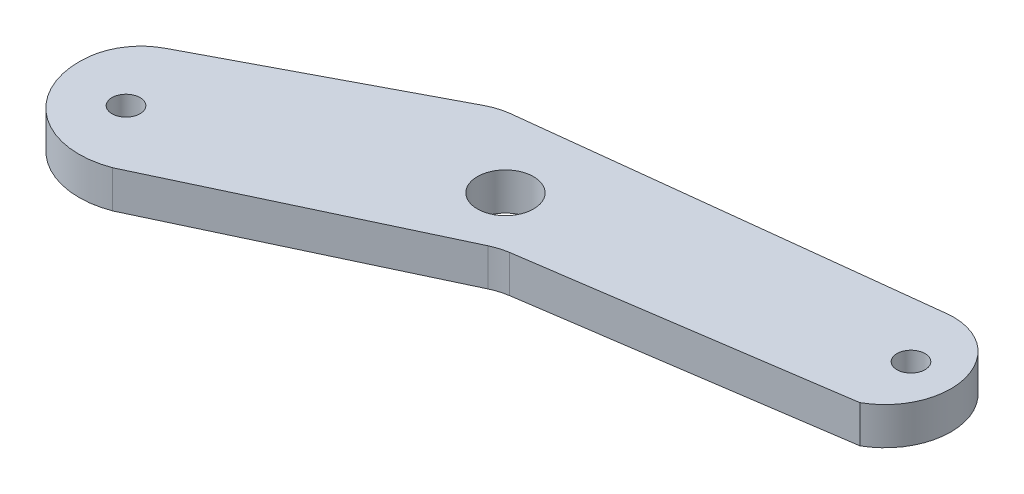
ISO-10303-21;
HEADER;
FILE_DESCRIPTION(('STEP AP214'),'2;1');
FILE_NAME('part.step','',(''),(''),'','','');
FILE_SCHEMA(('AUTOMOTIVE_DESIGN { 1 0 10303 214 1 1 1 1 }'));
ENDSEC;
DATA;
#1=APPLICATION_CONTEXT('core data for automotive mechanical design processes');
#2=APPLICATION_PROTOCOL_DEFINITION('international standard','automotive_design',2000,#1);
#3=PRODUCT_CONTEXT('',#1,'mechanical');
#4=PRODUCT('Part','Part','',(#3));
#5=PRODUCT_RELATED_PRODUCT_CATEGORY('part','',(#4));
#6=PRODUCT_DEFINITION_FORMATION('','',#4);
#7=PRODUCT_DEFINITION_CONTEXT('part definition',#1,'design');
#8=PRODUCT_DEFINITION('design','',#6,#7);
#9=PRODUCT_DEFINITION_SHAPE('','',#8);
#10=(LENGTH_UNIT() NAMED_UNIT(*) SI_UNIT(.MILLI.,.METRE.));
#11=(NAMED_UNIT(*) PLANE_ANGLE_UNIT() SI_UNIT($,.RADIAN.));
#12=(NAMED_UNIT(*) SI_UNIT($,.STERADIAN.) SOLID_ANGLE_UNIT());
#13=UNCERTAINTY_MEASURE_WITH_UNIT(LENGTH_MEASURE(1.E-05),#10,'distance_accuracy_value','');
#14=(GEOMETRIC_REPRESENTATION_CONTEXT(3) GLOBAL_UNCERTAINTY_ASSIGNED_CONTEXT((#13)) GLOBAL_UNIT_ASSIGNED_CONTEXT((#10,
#11,#12)) REPRESENTATION_CONTEXT('',''));
#15=CARTESIAN_POINT('',(0.,0.,0.));
#16=DIRECTION('',(0.,0.,1.));
#17=DIRECTION('',(1.,0.,0.));
#18=AXIS2_PLACEMENT_3D('',#15,#16,#17);
#19=CARTESIAN_POINT('',(79.6262763345411,6.35,-12.9163744045387));
#20=DIRECTION('',(0.,-1.,0.));
#21=DIRECTION('',(0.,0.,-1.));
#22=AXIS2_PLACEMENT_3D('',#19,#20,#21);
#23=CYLINDRICAL_SURFACE('',#22,9.99999999999997);
#24=CARTESIAN_POINT('',(79.6262763345411,0.,-12.9163744045387));
#25=DIRECTION('',(0.,1.,0.));
#26=DIRECTION('',(0.,0.,1.));
#27=AXIS2_PLACEMENT_3D('',#24,#25,#26);
#28=CIRCLE('',#27,9.99999999999997);
#29=CARTESIAN_POINT('',(78.4852568829757,0.,-22.8510648683201));
#30=VERTEX_POINT('',#29);
#31=CARTESIAN_POINT('',(87.197610529429,0.,-19.4489771407626));
#32=VERTEX_POINT('',#31);
#33=EDGE_CURVE('E168',#30,#32,#28,.F.);
#34=ORIENTED_EDGE('',*,*,#33,.F.);
#35=DIRECTION('',(0.,-1.,0.));
#36=VECTOR('',#35,1.);
#37=CARTESIAN_POINT('',(78.4852568829757,6.35,-22.8510648683201));
#38=LINE('',#37,#36);
#39=CARTESIAN_POINT('',(78.4852568829757,6.35,-22.8510648683201));
#40=VERTEX_POINT('',#39);
#41=EDGE_CURVE('E11',#40,#30,#38,.T.);
#42=ORIENTED_EDGE('',*,*,#41,.F.);
#43=CARTESIAN_POINT('',(79.6262763345411,6.35,-12.9163744045387));
#44=DIRECTION('',(0.,1.,0.));
#45=DIRECTION('',(0.,0.,1.));
#46=AXIS2_PLACEMENT_3D('',#43,#44,#45);
#47=CIRCLE('',#46,9.99999999999997);
#48=CARTESIAN_POINT('',(87.197610529429,6.35,-19.4489771407626));
#49=VERTEX_POINT('',#48);
#50=EDGE_CURVE('E215',#40,#49,#47,.F.);
#51=ORIENTED_EDGE('',*,*,#50,.T.);
#52=DIRECTION('',(0.,-1.,0.));
#53=VECTOR('',#52,1.);
#54=CARTESIAN_POINT('',(87.197610529429,6.35,-19.4489771407626));
#55=LINE('',#54,#53);
#56=EDGE_CURVE('E63',#49,#32,#55,.T.);
#57=ORIENTED_EDGE('',*,*,#56,.T.);
#58=EDGE_LOOP('',(#34,#42,#51,#57));
#59=FACE_BOUND('',#58,.T.);
#60=ADVANCED_FACE('F46',(#59),#23,.T.);
#61=CARTESIAN_POINT('',(-1.56850297637671,6.35,-13.6567273594194));
#62=DIRECTION('',(-0.114101945156537,0.,-0.993469046378142));
#63=DIRECTION('',(-0.993469046378142,0.,0.114101945156537));
#64=AXIS2_PLACEMENT_3D('',#61,#62,#63);
#65=PLANE('',#64);
#66=DIRECTION('',(0.993469046378142,0.,-0.114101945156537));
#67=VECTOR('',#66,1.);
#68=CARTESIAN_POINT('',(-1.56850297637671,0.,-13.6567273594194));
#69=LINE('',#68,#67);
#70=CARTESIAN_POINT('',(12.1210381643381,0.,-15.2289990654686));
#71=VERTEX_POINT('',#70);
#72=EDGE_CURVE('E171',#71,#30,#69,.T.);
#73=ORIENTED_EDGE('',*,*,#72,.F.);
#74=DIRECTION('',(0.,-1.,0.));
#75=VECTOR('',#74,1.);
#76=CARTESIAN_POINT('',(12.1210381643381,6.35,-15.2289990654686));
#77=LINE('',#76,#75);
#78=CARTESIAN_POINT('',(12.1210381643381,6.35,-15.2289990654686));
#79=VERTEX_POINT('',#78);
#80=EDGE_CURVE('E55',#79,#71,#77,.T.);
#81=ORIENTED_EDGE('',*,*,#80,.F.);
#82=DIRECTION('',(0.993469046378142,0.,-0.114101945156537));
#83=VECTOR('',#82,1.);
#84=CARTESIAN_POINT('',(-1.56850297637671,6.35,-13.6567273594194));
#85=LINE('',#84,#83);
#86=EDGE_CURVE('E250',#79,#40,#85,.T.);
#87=ORIENTED_EDGE('',*,*,#86,.T.);
#88=ORIENTED_EDGE('',*,*,#41,.T.);
#89=EDGE_LOOP('',(#73,#81,#87,#88));
#90=FACE_BOUND('',#89,.T.);
#91=ADVANCED_FACE('F249',(#90),#65,.T.);
#92=CARTESIAN_POINT('',(13.2620576159034,6.35,-5.29430860168714));
#93=DIRECTION('',(0.,-1.,0.));
#94=DIRECTION('',(0.,0.,-1.));
#95=AXIS2_PLACEMENT_3D('',#92,#93,#94);
#96=CYLINDRICAL_SURFACE('',#95,10.);
#97=CARTESIAN_POINT('',(13.2620576159034,0.,-5.29430860168714));
#98=DIRECTION('',(0.,1.,0.));
#99=DIRECTION('',(0.,0.,1.));
#100=AXIS2_PLACEMENT_3D('',#97,#98,#99);
#101=CIRCLE('',#100,10.);
#102=CARTESIAN_POINT('',(8.61159413979149,0.,-14.1471719496299));
#103=VERTEX_POINT('',#102);
#104=EDGE_CURVE('E175',#71,#103,#101,.T.);
#105=ORIENTED_EDGE('',*,*,#104,.T.);
#106=DIRECTION('',(0.,-1.,0.));
#107=VECTOR('',#106,1.);
#108=CARTESIAN_POINT('',(8.61159413979149,6.35,-14.1471719496299));
#109=LINE('',#108,#107);
#110=CARTESIAN_POINT('',(8.61159413979149,6.35,-14.1471719496299));
#111=VERTEX_POINT('',#110);
#112=EDGE_CURVE('E231',#111,#103,#109,.T.);
#113=ORIENTED_EDGE('',*,*,#112,.F.);
#114=CARTESIAN_POINT('',(13.2620576159034,6.35,-5.29430860168714));
#115=DIRECTION('',(0.,1.,0.));
#116=DIRECTION('',(0.,0.,1.));
#117=AXIS2_PLACEMENT_3D('',#114,#115,#116);
#118=CIRCLE('',#117,10.);
#119=EDGE_CURVE('E240',#79,#111,#118,.T.);
#120=ORIENTED_EDGE('',*,*,#119,.F.);
#121=ORIENTED_EDGE('',*,*,#80,.T.);
#122=EDGE_LOOP('',(#105,#113,#120,#121));
#123=FACE_BOUND('',#122,.T.);
#124=ADVANCED_FACE('F238',(#123),#96,.T.);
#125=CARTESIAN_POINT('',(-3.96196589337099,6.35,-7.54220365849386));
#126=DIRECTION('',(0.465046347611194,0.,0.885286334794279));
#127=DIRECTION('',(0.885286334794279,0.,-0.465046347611194));
#128=AXIS2_PLACEMENT_3D('',#125,#126,#127);
#129=PLANE('',#128);
#130=DIRECTION('',(-0.885286334794279,0.,0.465046347611194));
#131=VECTOR('',#130,1.);
#132=CARTESIAN_POINT('',(-3.96196589337099,0.,-7.54220365849386));
#133=LINE('',#132,#131);
#134=CARTESIAN_POINT('',(-26.7513025622144,0.,4.42917482753039));
#135=VERTEX_POINT('',#134);
#136=EDGE_CURVE('E178',#103,#135,#133,.T.);
#137=ORIENTED_EDGE('',*,*,#136,.T.);
#138=DIRECTION('',(0.,-1.,0.));
#139=VECTOR('',#138,1.);
#140=CARTESIAN_POINT('',(-26.7513025622144,6.35,4.42917482753039));
#141=LINE('',#140,#139);
#142=CARTESIAN_POINT('',(-26.7513025622144,6.35,4.42917482753039));
#143=VERTEX_POINT('',#142);
#144=EDGE_CURVE('E228',#143,#135,#141,.T.);
#145=ORIENTED_EDGE('',*,*,#144,.F.);
#146=DIRECTION('',(-0.885286334794279,0.,0.465046347611194));
#147=VECTOR('',#146,1.);
#148=CARTESIAN_POINT('',(-3.96196589337099,6.35,-7.54220365849386));
#149=LINE('',#148,#147);
#150=EDGE_CURVE('E404',#111,#143,#149,.T.);
#151=ORIENTED_EDGE('',*,*,#150,.F.);
#152=ORIENTED_EDGE('',*,*,#112,.T.);
#153=EDGE_LOOP('',(#137,#145,#151,#152));
#154=FACE_BOUND('',#153,.T.);
#155=ADVANCED_FACE('F273',(#154),#129,.F.);
#156=CARTESIAN_POINT('',(-22.1008390861025,6.35,13.2820381754732));
#157=DIRECTION('',(0.,-1.,0.));
#158=DIRECTION('',(0.,0.,-1.));
#159=AXIS2_PLACEMENT_3D('',#156,#157,#158);
#160=CYLINDRICAL_SURFACE('',#159,10.);
#161=CARTESIAN_POINT('',(-22.1008390861025,0.,13.2820381754732));
#162=DIRECTION('',(0.,1.,0.));
#163=DIRECTION('',(0.,0.,1.));
#164=AXIS2_PLACEMENT_3D('',#161,#162,#163);
#165=CIRCLE('',#164,10.);
#166=CARTESIAN_POINT('',(-32.0126384037366,0.,11.9568082758145));
#167=VERTEX_POINT('',#166);
#168=EDGE_CURVE('E182',#167,#135,#165,.F.);
#169=ORIENTED_EDGE('',*,*,#168,.F.);
#170=DIRECTION('',(0.,-1.,0.));
#171=VECTOR('',#170,1.);
#172=CARTESIAN_POINT('',(-32.0126384037366,6.35,11.9568082758145));
#173=LINE('',#172,#171);
#174=CARTESIAN_POINT('',(-32.0126384037366,6.35,11.9568082758145));
#175=VERTEX_POINT('',#174);
#176=EDGE_CURVE('E225',#175,#167,#173,.T.);
#177=ORIENTED_EDGE('',*,*,#176,.F.);
#178=CARTESIAN_POINT('',(-22.1008390861025,6.35,13.2820381754732));
#179=DIRECTION('',(0.,1.,0.));
#180=DIRECTION('',(0.,0.,1.));
#181=AXIS2_PLACEMENT_3D('',#178,#179,#180);
#182=CIRCLE('',#181,10.);
#183=EDGE_CURVE('E402',#175,#143,#182,.F.);
#184=ORIENTED_EDGE('',*,*,#183,.T.);
#185=ORIENTED_EDGE('',*,*,#144,.T.);
#186=EDGE_LOOP('',(#169,#177,#184,#185));
#187=FACE_BOUND('',#186,.T.);
#188=ADVANCED_FACE('F278',(#187),#160,.T.);
#189=CARTESIAN_POINT('',(-18.5273450422471,6.35,13.7598223800771));
#190=DIRECTION('',(0.,-1.,0.));
#191=DIRECTION('',(0.,0.,-1.));
#192=AXIS2_PLACEMENT_3D('',#189,#190,#191);
#193=CYLINDRICAL_SURFACE('',#192,13.6052929738981);
#194=CARTESIAN_POINT('',(-18.5273450422471,0.,13.7598223800771));
#195=DIRECTION('',(0.,1.,0.));
#196=DIRECTION('',(0.,0.,1.));
#197=AXIS2_PLACEMENT_3D('',#194,#195,#196);
#198=CIRCLE('',#197,13.6052929738981);
#199=CARTESIAN_POINT('',(-13.7071323255182,0.,26.4826187028627));
#200=VERTEX_POINT('',#199);
#201=EDGE_CURVE('E186',#167,#200,#198,.T.);
#202=ORIENTED_EDGE('',*,*,#201,.T.);
#203=DIRECTION('',(0.,-1.,0.));
#204=VECTOR('',#203,1.);
#205=CARTESIAN_POINT('',(-13.7071323255182,6.35,26.4826187028627));
#206=LINE('',#205,#204);
#207=CARTESIAN_POINT('',(-13.7071323255182,6.35,26.4826187028627));
#208=VERTEX_POINT('',#207);
#209=EDGE_CURVE('E222',#208,#200,#206,.T.);
#210=ORIENTED_EDGE('',*,*,#209,.F.);
#211=CARTESIAN_POINT('',(-18.5273450422471,6.35,13.7598223800771));
#212=DIRECTION('',(0.,1.,0.));
#213=DIRECTION('',(0.,0.,1.));
#214=AXIS2_PLACEMENT_3D('',#211,#212,#213);
#215=CIRCLE('',#214,13.6052929738981);
#216=EDGE_CURVE('E409',#175,#208,#215,.T.);
#217=ORIENTED_EDGE('',*,*,#216,.F.);
#218=ORIENTED_EDGE('',*,*,#176,.T.);
#219=EDGE_LOOP('',(#202,#210,#217,#218));
#220=FACE_BOUND('',#219,.T.);
#221=ADVANCED_FACE('F282',(#220),#193,.T.);
#222=CARTESIAN_POINT('',(7.71730828212871,6.35,16.4025212074978));
#223=DIRECTION('',(0.425728150166031,0.,0.904851116016447));
#224=DIRECTION('',(0.904851116016447,0.,-0.425728150166031));
#225=AXIS2_PLACEMENT_3D('',#222,#223,#224);
#226=PLANE('',#225);
#227=DIRECTION('',(-0.904851116016447,0.,0.425728150166031));
#228=VECTOR('',#227,1.);
#229=CARTESIAN_POINT('',(7.71730828212871,0.,16.4025212074978));
#230=LINE('',#229,#228);
#231=CARTESIAN_POINT('',(29.6137140148284,0.,6.10036636360895));
#232=VERTEX_POINT('',#231);
#233=EDGE_CURVE('E190',#232,#200,#230,.T.);
#234=ORIENTED_EDGE('',*,*,#233,.F.);
#235=DIRECTION('',(0.,-1.,0.));
#236=VECTOR('',#235,1.);
#237=CARTESIAN_POINT('',(29.6137140148284,6.35,6.10036636360895));
#238=LINE('',#237,#236);
#239=CARTESIAN_POINT('',(29.6137140148284,6.35,6.10036636360895));
#240=VERTEX_POINT('',#239);
#241=EDGE_CURVE('E135',#240,#232,#238,.T.);
#242=ORIENTED_EDGE('',*,*,#241,.F.);
#243=DIRECTION('',(-0.904851116016447,0.,0.425728150166031));
#244=VECTOR('',#243,1.);
#245=CARTESIAN_POINT('',(7.71730828212871,6.35,16.4025212074978));
#246=LINE('',#245,#244);
#247=EDGE_CURVE('E145',#240,#208,#246,.T.);
#248=ORIENTED_EDGE('',*,*,#247,.T.);
#249=ORIENTED_EDGE('',*,*,#209,.T.);
#250=EDGE_LOOP('',(#234,#242,#248,#249));
#251=FACE_BOUND('',#250,.T.);
#252=ADVANCED_FACE('F286',(#251),#226,.T.);
#253=CARTESIAN_POINT('',(33.8709955164887,6.35,15.1488775237734));
#254=DIRECTION('',(0.,-1.,0.));
#255=DIRECTION('',(0.,0.,-1.));
#256=AXIS2_PLACEMENT_3D('',#253,#254,#255);
#257=CYLINDRICAL_SURFACE('',#256,10.);
#258=CARTESIAN_POINT('',(33.8709955164887,0.,15.1488775237734));
#259=DIRECTION('',(0.,1.,0.));
#260=DIRECTION('',(0.,0.,1.));
#261=AXIS2_PLACEMENT_3D('',#258,#259,#260);
#262=CIRCLE('',#261,10.);
#263=CARTESIAN_POINT('',(32.4101652308645,0.,5.25615419414354));
#264=VERTEX_POINT('',#263);
#265=EDGE_CURVE('E130',#264,#232,#262,.T.);
#266=ORIENTED_EDGE('',*,*,#265,.F.);
#267=DIRECTION('',(0.,-1.,0.));
#268=VECTOR('',#267,1.);
#269=CARTESIAN_POINT('',(32.4101652308645,6.35,5.25615419414354));
#270=LINE('',#269,#268);
#271=CARTESIAN_POINT('',(32.4101652308645,6.35,5.25615419414354));
#272=VERTEX_POINT('',#271);
#273=EDGE_CURVE('E125',#272,#264,#270,.T.);
#274=ORIENTED_EDGE('',*,*,#273,.F.);
#275=CARTESIAN_POINT('',(33.8709955164887,6.35,15.1488775237734));
#276=DIRECTION('',(0.,1.,0.));
#277=DIRECTION('',(0.,0.,1.));
#278=AXIS2_PLACEMENT_3D('',#275,#276,#277);
#279=CIRCLE('',#278,10.);
#280=EDGE_CURVE('E128',#272,#240,#279,.T.);
#281=ORIENTED_EDGE('',*,*,#280,.T.);
#282=ORIENTED_EDGE('',*,*,#241,.T.);
#283=EDGE_LOOP('',(#266,#274,#281,#282));
#284=FACE_BOUND('',#283,.T.);
#285=ADVANCED_FACE('F127',(#284),#257,.F.);
#286=CARTESIAN_POINT('',(1.45123891443628,6.35,9.82777069108807));
#287=DIRECTION('',(0.146083028562412,0.,0.989272332962988));
#288=DIRECTION('',(0.989272332962988,0.,-0.146083028562412));
#289=AXIS2_PLACEMENT_3D('',#286,#287,#288);
#290=PLANE('',#289);
#291=DIRECTION('',(-0.989272332962988,0.,0.146083028562412));
#292=VECTOR('',#291,1.);
#293=CARTESIAN_POINT('',(1.45123891443628,0.,9.82777069108807));
#294=LINE('',#293,#292);
#295=CARTESIAN_POINT('',(84.2132155935168,0.,-2.39345474931262));
#296=VERTEX_POINT('',#295);
#297=EDGE_CURVE('E196',#296,#264,#294,.T.);
#298=ORIENTED_EDGE('',*,*,#297,.F.);
#299=DIRECTION('',(0.,-1.,0.));
#300=VECTOR('',#299,1.);
#301=CARTESIAN_POINT('',(84.2132155935168,6.35,-2.39345474931262));
#302=LINE('',#301,#300);
#303=CARTESIAN_POINT('',(84.2132155935168,6.35,-2.39345474931262));
#304=VERTEX_POINT('',#303);
#305=EDGE_CURVE('E94',#304,#296,#302,.T.);
#306=ORIENTED_EDGE('',*,*,#305,.F.);
#307=DIRECTION('',(-0.989272332962988,0.,0.146083028562412));
#308=VECTOR('',#307,1.);
#309=CARTESIAN_POINT('',(1.45123891443628,6.35,9.82777069108807));
#310=LINE('',#309,#308);
#311=EDGE_CURVE('E143',#304,#272,#310,.T.);
#312=ORIENTED_EDGE('',*,*,#311,.T.);
#313=ORIENTED_EDGE('',*,*,#273,.T.);
#314=EDGE_LOOP('',(#298,#306,#312,#313));
#315=FACE_BOUND('',#314,.T.);
#316=ADVANCED_FACE('F148',(#315),#290,.T.);
#317=CARTESIAN_POINT('',(23.3062872183733,6.35,-3.16551427106932));
#318=DIRECTION('',(0.,-1.,0.));
#319=DIRECTION('',(0.,0.,-1.));
#320=AXIS2_PLACEMENT_3D('',#317,#318,#319);
#321=CYLINDRICAL_SURFACE('',#320,4.7625);
#322=CARTESIAN_POINT('',(23.3062872183733,6.35,-3.16551427106932));
#323=DIRECTION('',(0.,1.,0.));
#324=DIRECTION('',(0.,0.,1.));
#325=AXIS2_PLACEMENT_3D('',#322,#323,#324);
#326=CIRCLE('',#325,4.7625);
#327=CARTESIAN_POINT('',(23.3062872183733,6.35,1.59698572893068));
#328=VERTEX_POINT('',#327);
#329=EDGE_CURVE('E160',#328,#328,#326,.T.);
#330=ORIENTED_EDGE('',*,*,#329,.T.);
#331=EDGE_LOOP('',(#330));
#332=FACE_BOUND('',#331,.T.);
#333=CARTESIAN_POINT('',(23.3062872183733,0.,-3.16551427106932));
#334=DIRECTION('',(0.,1.,0.));
#335=DIRECTION('',(0.,0.,1.));
#336=AXIS2_PLACEMENT_3D('',#333,#334,#335);
#337=CIRCLE('',#336,4.7625);
#338=CARTESIAN_POINT('',(23.3062872183733,0.,1.59698572893068));
#339=VERTEX_POINT('',#338);
#340=EDGE_CURVE('E207',#339,#339,#337,.T.);
#341=ORIENTED_EDGE('',*,*,#340,.F.);
#342=EDGE_LOOP('',(#341));
#343=FACE_BOUND('',#342,.T.);
#344=ADVANCED_FACE('F262',(#332,#343),#321,.F.);
#345=CARTESIAN_POINT('',(-21.6937127816267,6.35,16.225205158596));
#346=DIRECTION('',(0.,-1.,0.));
#347=DIRECTION('',(0.,0.,-1.));
#348=AXIS2_PLACEMENT_3D('',#345,#346,#347);
#349=CYLINDRICAL_SURFACE('',#348,2.38125);
#350=CARTESIAN_POINT('',(-21.6937127816267,6.35,16.225205158596));
#351=DIRECTION('',(0.,1.,0.));
#352=DIRECTION('',(0.,0.,1.));
#353=AXIS2_PLACEMENT_3D('',#350,#351,#352);
#354=CIRCLE('',#353,2.38125);
#355=CARTESIAN_POINT('',(-21.6937127816267,6.35,18.606455158596));
#356=VERTEX_POINT('',#355);
#357=EDGE_CURVE('E153',#356,#356,#354,.T.);
#358=ORIENTED_EDGE('',*,*,#357,.T.);
#359=EDGE_LOOP('',(#358));
#360=FACE_BOUND('',#359,.T.);
#361=CARTESIAN_POINT('',(-21.6937127816267,0.,16.225205158596));
#362=DIRECTION('',(0.,1.,0.));
#363=DIRECTION('',(0.,0.,1.));
#364=AXIS2_PLACEMENT_3D('',#361,#362,#363);
#365=CIRCLE('',#364,2.38125);
#366=CARTESIAN_POINT('',(-21.6937127816267,0.,18.606455158596));
#367=VERTEX_POINT('',#366);
#368=EDGE_CURVE('E203',#367,#367,#365,.T.);
#369=ORIENTED_EDGE('',*,*,#368,.F.);
#370=EDGE_LOOP('',(#369));
#371=FACE_BOUND('',#370,.T.);
#372=ADVANCED_FACE('F254',(#360,#371),#349,.F.);
#373=CARTESIAN_POINT('',(78.72876771407,6.35,-12.1419973767974));
#374=DIRECTION('',(0.,-1.,0.));
#375=DIRECTION('',(0.,0.,-1.));
#376=AXIS2_PLACEMENT_3D('',#373,#374,#375);
#377=CYLINDRICAL_SURFACE('',#376,11.1854035198671);
#378=CARTESIAN_POINT('',(78.72876771407,0.,-12.1419973767974));
#379=DIRECTION('',(0.,1.,0.));
#380=DIRECTION('',(0.,0.,1.));
#381=AXIS2_PLACEMENT_3D('',#378,#379,#380);
#382=CIRCLE('',#381,11.1854035198671);
#383=EDGE_CURVE('E199',#32,#296,#382,.F.);
#384=ORIENTED_EDGE('',*,*,#383,.F.);
#385=ORIENTED_EDGE('',*,*,#56,.F.);
#386=CARTESIAN_POINT('',(78.72876771407,6.35,-12.1419973767974));
#387=DIRECTION('',(0.,1.,0.));
#388=DIRECTION('',(0.,0.,1.));
#389=AXIS2_PLACEMENT_3D('',#386,#387,#388);
#390=CIRCLE('',#389,11.1854035198671);
#391=EDGE_CURVE('E150',#49,#304,#390,.F.);
#392=ORIENTED_EDGE('',*,*,#391,.T.);
#393=ORIENTED_EDGE('',*,*,#305,.T.);
#394=EDGE_LOOP('',(#384,#385,#392,#393));
#395=FACE_BOUND('',#394,.T.);
#396=ADVANCED_FACE('F251',(#395),#377,.T.);
#397=CARTESIAN_POINT('',(82.5344631227526,6.35,-12.758385532579));
#398=DIRECTION('',(0.,-1.,0.));
#399=DIRECTION('',(0.,0.,-1.));
#400=AXIS2_PLACEMENT_3D('',#397,#398,#399);
#401=CYLINDRICAL_SURFACE('',#400,2.38125000000001);
#402=CARTESIAN_POINT('',(82.5344631227526,6.35,-12.758385532579));
#403=DIRECTION('',(0.,1.,0.));
#404=DIRECTION('',(0.,0.,1.));
#405=AXIS2_PLACEMENT_3D('',#402,#403,#404);
#406=CIRCLE('',#405,2.38125000000001);
#407=CARTESIAN_POINT('',(82.5344631227526,6.35,-10.377135532579));
#408=VERTEX_POINT('',#407);
#409=EDGE_CURVE('E164',#408,#408,#406,.T.);
#410=ORIENTED_EDGE('',*,*,#409,.T.);
#411=EDGE_LOOP('',(#410));
#412=FACE_BOUND('',#411,.T.);
#413=CARTESIAN_POINT('',(82.5344631227526,0.,-12.758385532579));
#414=DIRECTION('',(0.,1.,0.));
#415=DIRECTION('',(0.,0.,1.));
#416=AXIS2_PLACEMENT_3D('',#413,#414,#415);
#417=CIRCLE('',#416,2.38125000000001);
#418=CARTESIAN_POINT('',(82.5344631227526,0.,-10.377135532579));
#419=VERTEX_POINT('',#418);
#420=EDGE_CURVE('E211',#419,#419,#417,.T.);
#421=ORIENTED_EDGE('',*,*,#420,.F.);
#422=EDGE_LOOP('',(#421));
#423=FACE_BOUND('',#422,.T.);
#424=ADVANCED_FACE('F253',(#412,#423),#401,.F.);
#425=CARTESIAN_POINT('',(0.,6.35,0.));
#426=DIRECTION('',(0.,1.,0.));
#427=DIRECTION('',(0.,0.,1.));
#428=AXIS2_PLACEMENT_3D('',#425,#426,#427);
#429=PLANE('',#428);
#430=ORIENTED_EDGE('',*,*,#50,.F.);
#431=ORIENTED_EDGE('',*,*,#86,.F.);
#432=ORIENTED_EDGE('',*,*,#119,.T.);
#433=ORIENTED_EDGE('',*,*,#150,.T.);
#434=ORIENTED_EDGE('',*,*,#183,.F.);
#435=ORIENTED_EDGE('',*,*,#216,.T.);
#436=ORIENTED_EDGE('',*,*,#247,.F.);
#437=ORIENTED_EDGE('',*,*,#280,.F.);
#438=ORIENTED_EDGE('',*,*,#311,.F.);
#439=ORIENTED_EDGE('',*,*,#391,.F.);
#440=EDGE_LOOP('',(#430,#431,#432,#433,#434,#435,#436,#437,#438,#439));
#441=FACE_BOUND('',#440,.T.);
#442=ORIENTED_EDGE('',*,*,#357,.F.);
#443=EDGE_LOOP('',(#442));
#444=FACE_BOUND('',#443,.T.);
#445=ORIENTED_EDGE('',*,*,#329,.F.);
#446=EDGE_LOOP('',(#445));
#447=FACE_BOUND('',#446,.T.);
#448=ORIENTED_EDGE('',*,*,#409,.F.);
#449=EDGE_LOOP('',(#448));
#450=FACE_BOUND('',#449,.T.);
#451=ADVANCED_FACE('F140',(#441,#444,#447,#450),#429,.T.);
#452=CARTESIAN_POINT('',(0.,0.,0.));
#453=DIRECTION('',(0.,1.,0.));
#454=DIRECTION('',(0.,0.,1.));
#455=AXIS2_PLACEMENT_3D('',#452,#453,#454);
#456=PLANE('',#455);
#457=ORIENTED_EDGE('',*,*,#33,.T.);
#458=ORIENTED_EDGE('',*,*,#383,.T.);
#459=ORIENTED_EDGE('',*,*,#297,.T.);
#460=ORIENTED_EDGE('',*,*,#265,.T.);
#461=ORIENTED_EDGE('',*,*,#233,.T.);
#462=ORIENTED_EDGE('',*,*,#201,.F.);
#463=ORIENTED_EDGE('',*,*,#168,.T.);
#464=ORIENTED_EDGE('',*,*,#136,.F.);
#465=ORIENTED_EDGE('',*,*,#104,.F.);
#466=ORIENTED_EDGE('',*,*,#72,.T.);
#467=EDGE_LOOP('',(#457,#458,#459,#460,#461,#462,#463,#464,#465,#466));
#468=FACE_BOUND('',#467,.T.);
#469=ORIENTED_EDGE('',*,*,#368,.T.);
#470=EDGE_LOOP('',(#469));
#471=FACE_BOUND('',#470,.T.);
#472=ORIENTED_EDGE('',*,*,#340,.T.);
#473=EDGE_LOOP('',(#472));
#474=FACE_BOUND('',#473,.T.);
#475=ORIENTED_EDGE('',*,*,#420,.T.);
#476=EDGE_LOOP('',(#475));
#477=FACE_BOUND('',#476,.T.);
#478=ADVANCED_FACE('F247',(#468,#471,#474,#477),#456,.F.);
#479=CLOSED_SHELL('',(#60,#91,#124,#155,#188,#221,#252,#285,#316,#344,#372,#396,#424,#451,#478));
#480=MANIFOLD_SOLID_BREP('B2',#479);
#481=ADVANCED_BREP_SHAPE_REPRESENTATION('',(#18,#480),#14);
#482=SHAPE_DEFINITION_REPRESENTATION(#9,#481);
ENDSEC;
END-ISO-10303-21;
